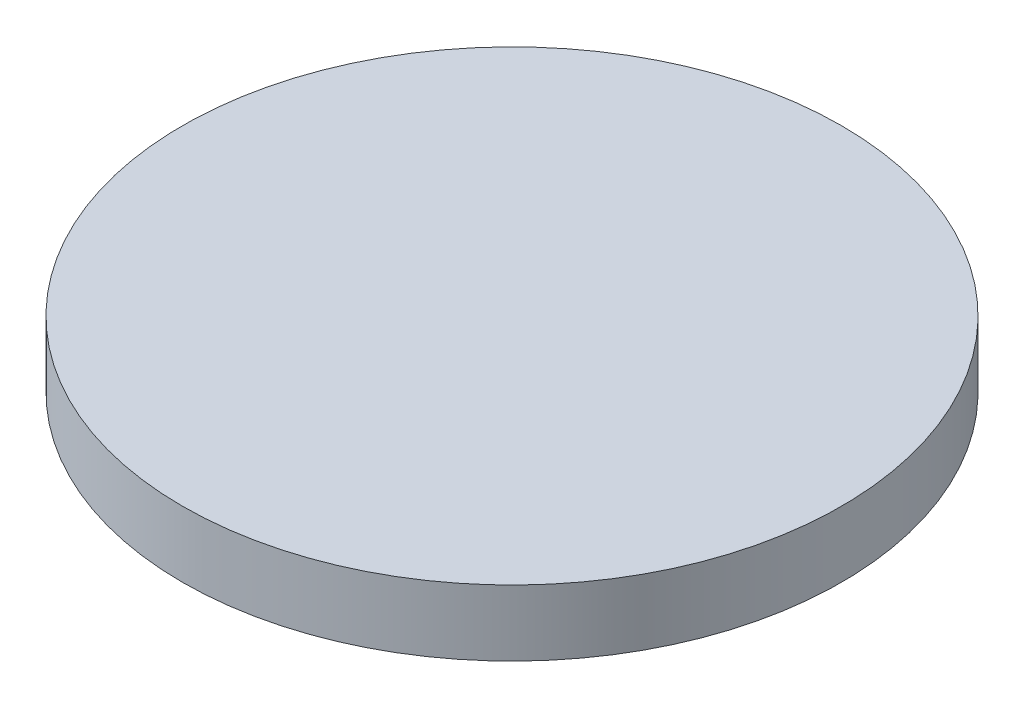
ISO-10303-21;
HEADER;
FILE_DESCRIPTION(('STEP AP214'),'2;1');
FILE_NAME('part.step','',(''),(''),'','','');
FILE_SCHEMA(('AUTOMOTIVE_DESIGN { 1 0 10303 214 1 1 1 1 }'));
ENDSEC;
DATA;
#1=APPLICATION_CONTEXT('core data for automotive mechanical design processes');
#2=APPLICATION_PROTOCOL_DEFINITION('international standard','automotive_design',2000,#1);
#3=PRODUCT_CONTEXT('',#1,'mechanical');
#4=PRODUCT('Part','Part','',(#3));
#5=PRODUCT_RELATED_PRODUCT_CATEGORY('part','',(#4));
#6=PRODUCT_DEFINITION_FORMATION('','',#4);
#7=PRODUCT_DEFINITION_CONTEXT('part definition',#1,'design');
#8=PRODUCT_DEFINITION('design','',#6,#7);
#9=PRODUCT_DEFINITION_SHAPE('','',#8);
#10=(LENGTH_UNIT() NAMED_UNIT(*) SI_UNIT(.MILLI.,.METRE.));
#11=(NAMED_UNIT(*) PLANE_ANGLE_UNIT() SI_UNIT($,.RADIAN.));
#12=(NAMED_UNIT(*) SI_UNIT($,.STERADIAN.) SOLID_ANGLE_UNIT());
#13=UNCERTAINTY_MEASURE_WITH_UNIT(LENGTH_MEASURE(1.E-05),#10,'distance_accuracy_value','');
#14=(GEOMETRIC_REPRESENTATION_CONTEXT(3) GLOBAL_UNCERTAINTY_ASSIGNED_CONTEXT((#13)) GLOBAL_UNIT_ASSIGNED_CONTEXT((#10,
#11,#12)) REPRESENTATION_CONTEXT('',''));
#15=CARTESIAN_POINT('',(0.,0.,0.));
#16=DIRECTION('',(0.,0.,1.));
#17=DIRECTION('',(1.,0.,0.));
#18=AXIS2_PLACEMENT_3D('',#15,#16,#17);
#19=CARTESIAN_POINT('',(0.,10.,0.));
#20=DIRECTION('',(0.,-1.,0.));
#21=DIRECTION('',(0.,0.,-1.));
#22=AXIS2_PLACEMENT_3D('',#19,#20,#21);
#23=CYLINDRICAL_SURFACE('',#22,50.);
#24=CARTESIAN_POINT('',(0.,10.,0.));
#25=DIRECTION('',(0.,1.,0.));
#26=DIRECTION('',(0.,0.,1.));
#27=AXIS2_PLACEMENT_3D('',#24,#25,#26);
#28=CIRCLE('',#27,50.);
#29=CARTESIAN_POINT('',(0.,10.,50.));
#30=VERTEX_POINT('',#29);
#31=EDGE_CURVE('E10',#30,#30,#28,.T.);
#32=ORIENTED_EDGE('',*,*,#31,.F.);
#33=EDGE_LOOP('',(#32));
#34=FACE_BOUND('',#33,.T.);
#35=CARTESIAN_POINT('',(0.,0.,0.));
#36=DIRECTION('',(0.,1.,0.));
#37=DIRECTION('',(0.,0.,1.));
#38=AXIS2_PLACEMENT_3D('',#35,#36,#37);
#39=CIRCLE('',#38,50.);
#40=CARTESIAN_POINT('',(0.,0.,50.));
#41=VERTEX_POINT('',#40);
#42=EDGE_CURVE('E34',#41,#41,#39,.T.);
#43=ORIENTED_EDGE('',*,*,#42,.T.);
#44=EDGE_LOOP('',(#43));
#45=FACE_BOUND('',#44,.T.);
#46=ADVANCED_FACE('F31',(#34,#45),#23,.T.);
#47=CARTESIAN_POINT('',(0.,10.,0.));
#48=DIRECTION('',(0.,1.,0.));
#49=DIRECTION('',(0.,0.,1.));
#50=AXIS2_PLACEMENT_3D('',#47,#48,#49);
#51=PLANE('',#50);
#52=ORIENTED_EDGE('',*,*,#31,.T.);
#53=EDGE_LOOP('',(#52));
#54=FACE_BOUND('',#53,.T.);
#55=ADVANCED_FACE('F46',(#54),#51,.T.);
#56=CARTESIAN_POINT('',(0.,0.,0.));
#57=DIRECTION('',(0.,1.,0.));
#58=DIRECTION('',(0.,0.,1.));
#59=AXIS2_PLACEMENT_3D('',#56,#57,#58);
#60=PLANE('',#59);
#61=ORIENTED_EDGE('',*,*,#42,.F.);
#62=EDGE_LOOP('',(#61));
#63=FACE_BOUND('',#62,.T.);
#64=ADVANCED_FACE('F44',(#63),#60,.F.);
#65=CLOSED_SHELL('',(#46,#55,#64));
#66=MANIFOLD_SOLID_BREP('B2',#65);
#67=ADVANCED_BREP_SHAPE_REPRESENTATION('',(#18,#66),#14);
#68=SHAPE_DEFINITION_REPRESENTATION(#9,#67);
ENDSEC;
END-ISO-10303-21;
